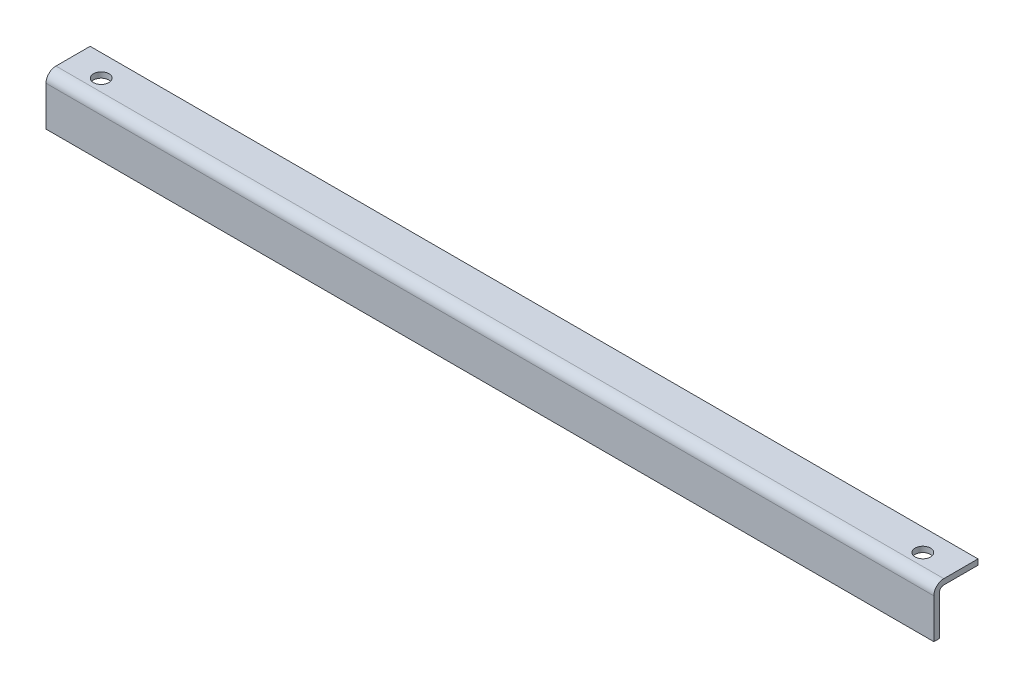
ISO-10303-21;
HEADER;
FILE_DESCRIPTION(('STEP AP214'),'2;1');
FILE_NAME('part.step','',(''),(''),'','','');
FILE_SCHEMA(('AUTOMOTIVE_DESIGN { 1 0 10303 214 1 1 1 1 }'));
ENDSEC;
DATA;
#1=APPLICATION_CONTEXT('core data for automotive mechanical design processes');
#2=APPLICATION_PROTOCOL_DEFINITION('international standard','automotive_design',2000,#1);
#3=PRODUCT_CONTEXT('',#1,'mechanical');
#4=PRODUCT('Part','Part','',(#3));
#5=PRODUCT_RELATED_PRODUCT_CATEGORY('part','',(#4));
#6=PRODUCT_DEFINITION_FORMATION('','',#4);
#7=PRODUCT_DEFINITION_CONTEXT('part definition',#1,'design');
#8=PRODUCT_DEFINITION('design','',#6,#7);
#9=PRODUCT_DEFINITION_SHAPE('','',#8);
#10=(LENGTH_UNIT() NAMED_UNIT(*) SI_UNIT(.MILLI.,.METRE.));
#11=(NAMED_UNIT(*) PLANE_ANGLE_UNIT() SI_UNIT($,.RADIAN.));
#12=(NAMED_UNIT(*) SI_UNIT($,.STERADIAN.) SOLID_ANGLE_UNIT());
#13=UNCERTAINTY_MEASURE_WITH_UNIT(LENGTH_MEASURE(1.E-05),#10,'distance_accuracy_value','');
#14=(GEOMETRIC_REPRESENTATION_CONTEXT(3) GLOBAL_UNCERTAINTY_ASSIGNED_CONTEXT((#13)) GLOBAL_UNIT_ASSIGNED_CONTEXT((#10,
#11,#12)) REPRESENTATION_CONTEXT('',''));
#15=CARTESIAN_POINT('',(0.,0.,0.));
#16=DIRECTION('',(0.,0.,1.));
#17=DIRECTION('',(1.,0.,0.));
#18=AXIS2_PLACEMENT_3D('',#15,#16,#17);
#19=CARTESIAN_POINT('',(201.13111431,2.5,10.));
#20=DIRECTION('',(-1.,0.,0.));
#21=DIRECTION('',(0.,0.,1.));
#22=AXIS2_PLACEMENT_3D('',#19,#20,#21);
#23=PLANE('',#22);
#24=DIRECTION('',(0.,0.,-1.));
#25=VECTOR('',#24,1.);
#26=CARTESIAN_POINT('',(201.13111431,2.5,10.));
#27=LINE('',#26,#25);
#28=CARTESIAN_POINT('',(201.13111431,2.5,5.5));
#29=VERTEX_POINT('',#28);
#30=CARTESIAN_POINT('',(201.13111431,2.5,-10.));
#31=VERTEX_POINT('',#30);
#32=EDGE_CURVE('E136',#29,#31,#27,.T.);
#33=ORIENTED_EDGE('',*,*,#32,.F.);
#34=CARTESIAN_POINT('',(201.13111431,-2.,5.5));
#35=DIRECTION('',(-1.,0.,0.));
#36=DIRECTION('',(0.,0.,1.));
#37=AXIS2_PLACEMENT_3D('',#34,#35,#36);
#38=CIRCLE('',#37,4.5);
#39=CARTESIAN_POINT('',(201.13111431,-2.,10.));
#40=VERTEX_POINT('',#39);
#41=EDGE_CURVE('E56',#29,#40,#38,.F.);
#42=ORIENTED_EDGE('',*,*,#41,.T.);
#43=DIRECTION('',(0.,-1.,0.));
#44=VECTOR('',#43,1.);
#45=CARTESIAN_POINT('',(201.13111431,2.5,10.));
#46=LINE('',#45,#44);
#47=CARTESIAN_POINT('',(201.13111431,-20.,10.));
#48=VERTEX_POINT('',#47);
#49=EDGE_CURVE('E95',#40,#48,#46,.T.);
#50=ORIENTED_EDGE('',*,*,#49,.T.);
#51=DIRECTION('',(0.,0.,1.));
#52=VECTOR('',#51,1.);
#53=CARTESIAN_POINT('',(201.13111431,-20.,10.));
#54=LINE('',#53,#52);
#55=CARTESIAN_POINT('',(201.13111431,-20.,7.5));
#56=VERTEX_POINT('',#55);
#57=EDGE_CURVE('E99',#56,#48,#54,.T.);
#58=ORIENTED_EDGE('',*,*,#57,.F.);
#59=DIRECTION('',(0.,1.,0.));
#60=VECTOR('',#59,1.);
#61=CARTESIAN_POINT('',(201.13111431,-20.,7.5));
#62=LINE('',#61,#60);
#63=CARTESIAN_POINT('',(201.13111431,-2.,7.5));
#64=VERTEX_POINT('',#63);
#65=EDGE_CURVE('E118',#56,#64,#62,.T.);
#66=ORIENTED_EDGE('',*,*,#65,.T.);
#67=CARTESIAN_POINT('',(201.13111431,-2.,5.5));
#68=DIRECTION('',(-1.,0.,0.));
#69=DIRECTION('',(0.,0.,1.));
#70=AXIS2_PLACEMENT_3D('',#67,#68,#69);
#71=CIRCLE('',#70,2.);
#72=CARTESIAN_POINT('',(201.13111431,0.,5.5));
#73=VERTEX_POINT('',#72);
#74=EDGE_CURVE('E160',#64,#73,#71,.T.);
#75=ORIENTED_EDGE('',*,*,#74,.T.);
#76=DIRECTION('',(0.,0.,-1.));
#77=VECTOR('',#76,1.);
#78=CARTESIAN_POINT('',(201.13111431,0.,10.));
#79=LINE('',#78,#77);
#80=CARTESIAN_POINT('',(201.13111431,0.,-10.));
#81=VERTEX_POINT('',#80);
#82=EDGE_CURVE('E127',#73,#81,#79,.T.);
#83=ORIENTED_EDGE('',*,*,#82,.T.);
#84=DIRECTION('',(0.,-1.,0.));
#85=VECTOR('',#84,1.);
#86=CARTESIAN_POINT('',(201.13111431,2.5,-10.));
#87=LINE('',#86,#85);
#88=EDGE_CURVE('E152',#31,#81,#87,.T.);
#89=ORIENTED_EDGE('',*,*,#88,.F.);
#90=EDGE_LOOP('',(#33,#42,#50,#58,#66,#75,#83,#89));
#91=FACE_BOUND('',#90,.T.);
#92=ADVANCED_FACE('F34',(#91),#23,.F.);
#93=CARTESIAN_POINT('',(-201.13111431,2.5,-10.));
#94=DIRECTION('',(0.,0.,1.));
#95=DIRECTION('',(1.,0.,0.));
#96=AXIS2_PLACEMENT_3D('',#93,#94,#95);
#97=PLANE('',#96);
#98=DIRECTION('',(-1.,0.,0.));
#99=VECTOR('',#98,1.);
#100=CARTESIAN_POINT('',(-201.13111431,0.,-10.));
#101=LINE('',#100,#99);
#102=CARTESIAN_POINT('',(-201.13111431,0.,-10.));
#103=VERTEX_POINT('',#102);
#104=EDGE_CURVE('E144',#81,#103,#101,.T.);
#105=ORIENTED_EDGE('',*,*,#104,.T.);
#106=DIRECTION('',(0.,-1.,0.));
#107=VECTOR('',#106,1.);
#108=CARTESIAN_POINT('',(-201.13111431,2.5,-10.));
#109=LINE('',#108,#107);
#110=CARTESIAN_POINT('',(-201.13111431,2.5,-10.));
#111=VERTEX_POINT('',#110);
#112=EDGE_CURVE('E149',#111,#103,#109,.T.);
#113=ORIENTED_EDGE('',*,*,#112,.F.);
#114=DIRECTION('',(-1.,0.,0.));
#115=VECTOR('',#114,1.);
#116=CARTESIAN_POINT('',(-201.13111431,2.5,-10.));
#117=LINE('',#116,#115);
#118=EDGE_CURVE('E138',#31,#111,#117,.T.);
#119=ORIENTED_EDGE('',*,*,#118,.F.);
#120=ORIENTED_EDGE('',*,*,#88,.T.);
#121=EDGE_LOOP('',(#105,#113,#119,#120));
#122=FACE_BOUND('',#121,.T.);
#123=ADVANCED_FACE('F178',(#122),#97,.F.);
#124=CARTESIAN_POINT('',(-201.13111431,2.5,10.));
#125=DIRECTION('',(1.,0.,0.));
#126=DIRECTION('',(0.,0.,-1.));
#127=AXIS2_PLACEMENT_3D('',#124,#125,#126);
#128=PLANE('',#127);
#129=DIRECTION('',(0.,-1.,0.));
#130=VECTOR('',#129,1.);
#131=CARTESIAN_POINT('',(-201.13111431,2.5,10.));
#132=LINE('',#131,#130);
#133=CARTESIAN_POINT('',(-201.13111431,-2.,10.));
#134=VERTEX_POINT('',#133);
#135=CARTESIAN_POINT('',(-201.13111431,-20.,9.99999999999995));
#136=VERTEX_POINT('',#135);
#137=EDGE_CURVE('E100',#134,#136,#132,.T.);
#138=ORIENTED_EDGE('',*,*,#137,.F.);
#139=CARTESIAN_POINT('',(-201.13111431,-2.,5.5));
#140=DIRECTION('',(1.,0.,0.));
#141=DIRECTION('',(0.,0.,-1.));
#142=AXIS2_PLACEMENT_3D('',#139,#140,#141);
#143=CIRCLE('',#142,4.5);
#144=CARTESIAN_POINT('',(-201.13111431,2.5,5.5));
#145=VERTEX_POINT('',#144);
#146=EDGE_CURVE('E11',#134,#145,#143,.F.);
#147=ORIENTED_EDGE('',*,*,#146,.T.);
#148=DIRECTION('',(0.,0.,1.));
#149=VECTOR('',#148,1.);
#150=CARTESIAN_POINT('',(-201.13111431,2.5,10.));
#151=LINE('',#150,#149);
#152=EDGE_CURVE('E101',#111,#145,#151,.T.);
#153=ORIENTED_EDGE('',*,*,#152,.F.);
#154=ORIENTED_EDGE('',*,*,#112,.T.);
#155=DIRECTION('',(0.,0.,1.));
#156=VECTOR('',#155,1.);
#157=CARTESIAN_POINT('',(-201.13111431,0.,10.));
#158=LINE('',#157,#156);
#159=CARTESIAN_POINT('',(-201.13111431,0.,5.49999999999995));
#160=VERTEX_POINT('',#159);
#161=EDGE_CURVE('E139',#103,#160,#158,.T.);
#162=ORIENTED_EDGE('',*,*,#161,.T.);
#163=CARTESIAN_POINT('',(-201.13111431,-2.,5.49999999999995));
#164=DIRECTION('',(1.,0.,0.));
#165=DIRECTION('',(0.,0.,-1.));
#166=AXIS2_PLACEMENT_3D('',#163,#164,#165);
#167=CIRCLE('',#166,2.);
#168=CARTESIAN_POINT('',(-201.13111431,-2.,7.49999999999995));
#169=VERTEX_POINT('',#168);
#170=EDGE_CURVE('E162',#160,#169,#167,.T.);
#171=ORIENTED_EDGE('',*,*,#170,.T.);
#172=DIRECTION('',(0.,1.,0.));
#173=VECTOR('',#172,1.);
#174=CARTESIAN_POINT('',(-201.13111431,-20.,7.49999999999995));
#175=LINE('',#174,#173);
#176=CARTESIAN_POINT('',(-201.13111431,-20.,7.49999999999995));
#177=VERTEX_POINT('',#176);
#178=EDGE_CURVE('E120',#177,#169,#175,.T.);
#179=ORIENTED_EDGE('',*,*,#178,.F.);
#180=DIRECTION('',(0.,0.,-1.));
#181=VECTOR('',#180,1.);
#182=CARTESIAN_POINT('',(-201.13111431,-20.,9.99999999999995));
#183=LINE('',#182,#181);
#184=EDGE_CURVE('E108',#136,#177,#183,.T.);
#185=ORIENTED_EDGE('',*,*,#184,.F.);
#186=EDGE_LOOP('',(#138,#147,#153,#154,#162,#171,#179,#185));
#187=FACE_BOUND('',#186,.T.);
#188=ADVANCED_FACE('F182',(#187),#128,.F.);
#189=CARTESIAN_POINT('',(-201.13111431,2.5,10.));
#190=DIRECTION('',(0.,0.,-1.));
#191=DIRECTION('',(-1.,0.,0.));
#192=AXIS2_PLACEMENT_3D('',#189,#190,#191);
#193=PLANE('',#192);
#194=ORIENTED_EDGE('',*,*,#49,.F.);
#195=DIRECTION('',(1.,0.,0.));
#196=VECTOR('',#195,1.);
#197=CARTESIAN_POINT('',(-201.13111431,-2.,10.));
#198=LINE('',#197,#196);
#199=EDGE_CURVE('E42',#40,#134,#198,.F.);
#200=ORIENTED_EDGE('',*,*,#199,.T.);
#201=ORIENTED_EDGE('',*,*,#137,.T.);
#202=DIRECTION('',(-1.,0.,0.));
#203=VECTOR('',#202,1.);
#204=CARTESIAN_POINT('',(201.13111431,-20.,10.));
#205=LINE('',#204,#203);
#206=EDGE_CURVE('E104',#48,#136,#205,.T.);
#207=ORIENTED_EDGE('',*,*,#206,.F.);
#208=EDGE_LOOP('',(#194,#200,#201,#207));
#209=FACE_BOUND('',#208,.T.);
#210=ADVANCED_FACE('F105',(#209),#193,.F.);
#211=CARTESIAN_POINT('',(0.,2.5,0.));
#212=DIRECTION('',(0.,-1.,0.));
#213=DIRECTION('',(0.,0.,-1.));
#214=AXIS2_PLACEMENT_3D('',#211,#212,#213);
#215=PLANE('',#214);
#216=CARTESIAN_POINT('',(186.13111431,2.5,0.));
#217=DIRECTION('',(0.,1.,0.));
#218=DIRECTION('',(0.,0.,1.));
#219=AXIS2_PLACEMENT_3D('',#216,#217,#218);
#220=CIRCLE('',#219,3.50000000000002);
#221=CARTESIAN_POINT('',(186.13111431,2.5,3.50000000000002));
#222=VERTEX_POINT('',#221);
#223=EDGE_CURVE('E128',#222,#222,#220,.T.);
#224=ORIENTED_EDGE('',*,*,#223,.F.);
#225=EDGE_LOOP('',(#224));
#226=FACE_BOUND('',#225,.T.);
#227=CARTESIAN_POINT('',(-186.13111431,2.5,0.));
#228=DIRECTION('',(0.,1.,0.));
#229=DIRECTION('',(0.,0.,1.));
#230=AXIS2_PLACEMENT_3D('',#227,#228,#229);
#231=CIRCLE('',#230,3.50000000000002);
#232=CARTESIAN_POINT('',(-186.13111431,2.5,3.50000000000002));
#233=VERTEX_POINT('',#232);
#234=EDGE_CURVE('E123',#233,#233,#231,.T.);
#235=ORIENTED_EDGE('',*,*,#234,.F.);
#236=EDGE_LOOP('',(#235));
#237=FACE_BOUND('',#236,.T.);
#238=ORIENTED_EDGE('',*,*,#152,.T.);
#239=DIRECTION('',(1.,0.,0.));
#240=VECTOR('',#239,1.);
#241=CARTESIAN_POINT('',(0.,2.5,5.5));
#242=LINE('',#241,#240);
#243=EDGE_CURVE('E164',#145,#29,#242,.T.);
#244=ORIENTED_EDGE('',*,*,#243,.T.);
#245=ORIENTED_EDGE('',*,*,#32,.T.);
#246=ORIENTED_EDGE('',*,*,#118,.T.);
#247=EDGE_LOOP('',(#238,#244,#245,#246));
#248=FACE_BOUND('',#247,.T.);
#249=ADVANCED_FACE('F169',(#226,#237,#248),#215,.F.);
#250=CARTESIAN_POINT('',(0.,0.,0.));
#251=DIRECTION('',(0.,-1.,0.));
#252=DIRECTION('',(0.,0.,-1.));
#253=AXIS2_PLACEMENT_3D('',#250,#251,#252);
#254=PLANE('',#253);
#255=ORIENTED_EDGE('',*,*,#82,.F.);
#256=DIRECTION('',(1.,0.,0.));
#257=VECTOR('',#256,1.);
#258=CARTESIAN_POINT('',(0.,0.,5.49999999999997));
#259=LINE('',#258,#257);
#260=EDGE_CURVE('E158',#73,#160,#259,.F.);
#261=ORIENTED_EDGE('',*,*,#260,.T.);
#262=ORIENTED_EDGE('',*,*,#161,.F.);
#263=ORIENTED_EDGE('',*,*,#104,.F.);
#264=EDGE_LOOP('',(#255,#261,#262,#263));
#265=FACE_BOUND('',#264,.T.);
#266=CARTESIAN_POINT('',(186.13111431,0.,0.));
#267=DIRECTION('',(0.,1.,0.));
#268=DIRECTION('',(0.,0.,1.));
#269=AXIS2_PLACEMENT_3D('',#266,#267,#268);
#270=CIRCLE('',#269,3.50000000000002);
#271=CARTESIAN_POINT('',(186.13111431,0.,3.50000000000002));
#272=VERTEX_POINT('',#271);
#273=EDGE_CURVE('E124',#272,#272,#270,.T.);
#274=ORIENTED_EDGE('',*,*,#273,.T.);
#275=EDGE_LOOP('',(#274));
#276=FACE_BOUND('',#275,.T.);
#277=CARTESIAN_POINT('',(-186.13111431,0.,0.));
#278=DIRECTION('',(0.,1.,0.));
#279=DIRECTION('',(0.,0.,1.));
#280=AXIS2_PLACEMENT_3D('',#277,#278,#279);
#281=CIRCLE('',#280,3.50000000000002);
#282=CARTESIAN_POINT('',(-186.13111431,0.,3.50000000000002));
#283=VERTEX_POINT('',#282);
#284=EDGE_CURVE('E131',#283,#283,#281,.T.);
#285=ORIENTED_EDGE('',*,*,#284,.T.);
#286=EDGE_LOOP('',(#285));
#287=FACE_BOUND('',#286,.T.);
#288=ADVANCED_FACE('F200',(#265,#276,#287),#254,.T.);
#289=CARTESIAN_POINT('',(-186.13111431,0.,0.));
#290=DIRECTION('',(0.,1.,0.));
#291=DIRECTION('',(0.,0.,1.));
#292=AXIS2_PLACEMENT_3D('',#289,#290,#291);
#293=CYLINDRICAL_SURFACE('',#292,3.50000000000002);
#294=ORIENTED_EDGE('',*,*,#284,.F.);
#295=EDGE_LOOP('',(#294));
#296=FACE_BOUND('',#295,.T.);
#297=ORIENTED_EDGE('',*,*,#234,.T.);
#298=EDGE_LOOP('',(#297));
#299=FACE_BOUND('',#298,.T.);
#300=ADVANCED_FACE('F203',(#296,#299),#293,.F.);
#301=CARTESIAN_POINT('',(186.13111431,0.,0.));
#302=DIRECTION('',(0.,1.,0.));
#303=DIRECTION('',(0.,0.,1.));
#304=AXIS2_PLACEMENT_3D('',#301,#302,#303);
#305=CYLINDRICAL_SURFACE('',#304,3.50000000000002);
#306=ORIENTED_EDGE('',*,*,#273,.F.);
#307=EDGE_LOOP('',(#306));
#308=FACE_BOUND('',#307,.T.);
#309=ORIENTED_EDGE('',*,*,#223,.T.);
#310=EDGE_LOOP('',(#309));
#311=FACE_BOUND('',#310,.T.);
#312=ADVANCED_FACE('F210',(#308,#311),#305,.F.);
#313=CARTESIAN_POINT('',(201.13111431,-20.,7.5));
#314=DIRECTION('',(0.,0.,1.));
#315=DIRECTION('',(1.,0.,0.));
#316=AXIS2_PLACEMENT_3D('',#313,#314,#315);
#317=PLANE('',#316);
#318=ORIENTED_EDGE('',*,*,#178,.T.);
#319=DIRECTION('',(1.,0.,0.));
#320=VECTOR('',#319,1.);
#321=CARTESIAN_POINT('',(201.13111431,-2.,7.5));
#322=LINE('',#321,#320);
#323=EDGE_CURVE('E155',#169,#64,#322,.T.);
#324=ORIENTED_EDGE('',*,*,#323,.T.);
#325=ORIENTED_EDGE('',*,*,#65,.F.);
#326=DIRECTION('',(1.,0.,0.));
#327=VECTOR('',#326,1.);
#328=CARTESIAN_POINT('',(201.13111431,-20.,7.5));
#329=LINE('',#328,#327);
#330=EDGE_CURVE('E112',#177,#56,#329,.T.);
#331=ORIENTED_EDGE('',*,*,#330,.F.);
#332=EDGE_LOOP('',(#318,#324,#325,#331));
#333=FACE_BOUND('',#332,.T.);
#334=ADVANCED_FACE('F214',(#333),#317,.F.);
#335=CARTESIAN_POINT('',(0.,-20.,0.));
#336=DIRECTION('',(0.,1.,0.));
#337=DIRECTION('',(0.,0.,1.));
#338=AXIS2_PLACEMENT_3D('',#335,#336,#337);
#339=PLANE('',#338);
#340=ORIENTED_EDGE('',*,*,#57,.T.);
#341=ORIENTED_EDGE('',*,*,#206,.T.);
#342=ORIENTED_EDGE('',*,*,#184,.T.);
#343=ORIENTED_EDGE('',*,*,#330,.T.);
#344=EDGE_LOOP('',(#340,#341,#342,#343));
#345=FACE_BOUND('',#344,.T.);
#346=ADVANCED_FACE('F110',(#345),#339,.F.);
#347=CARTESIAN_POINT('',(201.13111431,-2.,5.5));
#348=DIRECTION('',(1.,0.,0.));
#349=DIRECTION('',(0.,0.,-1.));
#350=AXIS2_PLACEMENT_3D('',#347,#348,#349);
#351=CYLINDRICAL_SURFACE('',#350,2.);
#352=ORIENTED_EDGE('',*,*,#170,.F.);
#353=ORIENTED_EDGE('',*,*,#260,.F.);
#354=ORIENTED_EDGE('',*,*,#74,.F.);
#355=ORIENTED_EDGE('',*,*,#323,.F.);
#356=EDGE_LOOP('',(#352,#353,#354,#355));
#357=FACE_BOUND('',#356,.T.);
#358=ADVANCED_FACE('F184',(#357),#351,.F.);
#359=CARTESIAN_POINT('',(0.,-2.,5.5));
#360=DIRECTION('',(1.,0.,0.));
#361=DIRECTION('',(0.,0.,-1.));
#362=AXIS2_PLACEMENT_3D('',#359,#360,#361);
#363=CYLINDRICAL_SURFACE('',#362,4.5);
#364=ORIENTED_EDGE('',*,*,#146,.F.);
#365=ORIENTED_EDGE('',*,*,#199,.F.);
#366=ORIENTED_EDGE('',*,*,#41,.F.);
#367=ORIENTED_EDGE('',*,*,#243,.F.);
#368=EDGE_LOOP('',(#364,#365,#366,#367));
#369=FACE_BOUND('',#368,.T.);
#370=ADVANCED_FACE('F36',(#369),#363,.T.);
#371=CLOSED_SHELL('',(#92,#123,#188,#210,#249,#288,#300,#312,#334,#346,#358,#370));
#372=MANIFOLD_SOLID_BREP('B2',#371);
#373=ADVANCED_BREP_SHAPE_REPRESENTATION('',(#18,#372),#14);
#374=SHAPE_DEFINITION_REPRESENTATION(#9,#373);
ENDSEC;
END-ISO-10303-21;
